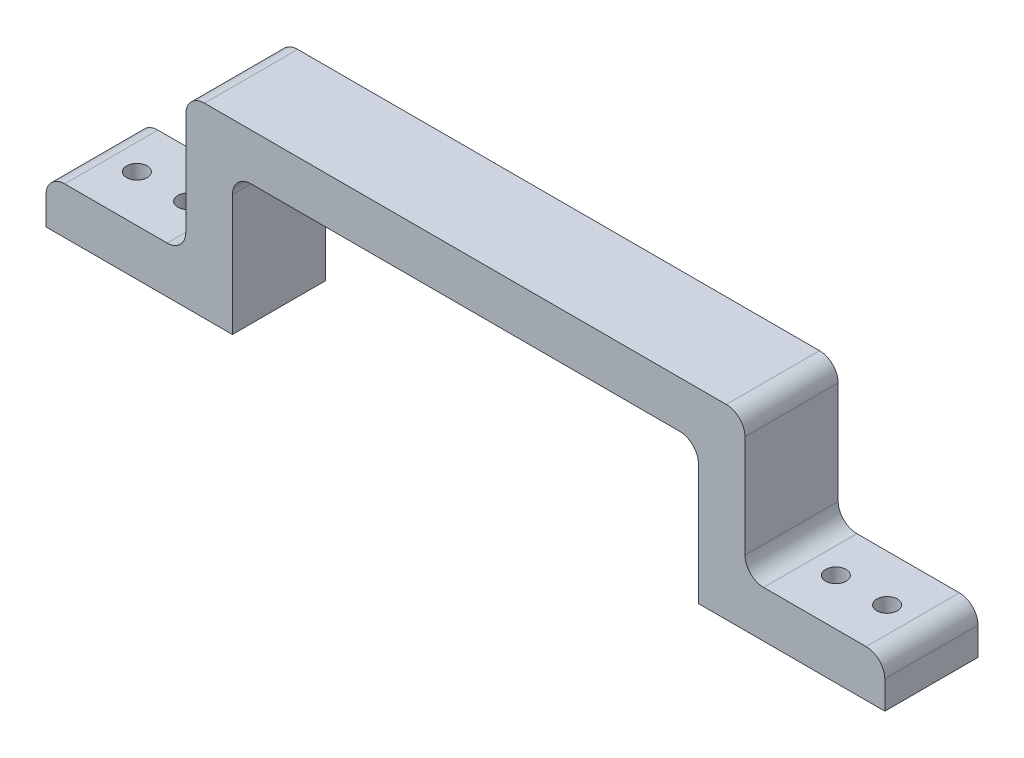
ISO-10303-21;
HEADER;
FILE_DESCRIPTION(('STEP AP214'),'2;1');
FILE_NAME('part.step','',(''),(''),'','','');
FILE_SCHEMA(('AUTOMOTIVE_DESIGN { 1 0 10303 214 1 1 1 1 }'));
ENDSEC;
DATA;
#1=APPLICATION_CONTEXT('core data for automotive mechanical design processes');
#2=APPLICATION_PROTOCOL_DEFINITION('international standard','automotive_design',2000,#1);
#3=PRODUCT_CONTEXT('',#1,'mechanical');
#4=PRODUCT('Part','Part','',(#3));
#5=PRODUCT_RELATED_PRODUCT_CATEGORY('part','',(#4));
#6=PRODUCT_DEFINITION_FORMATION('','',#4);
#7=PRODUCT_DEFINITION_CONTEXT('part definition',#1,'design');
#8=PRODUCT_DEFINITION('design','',#6,#7);
#9=PRODUCT_DEFINITION_SHAPE('','',#8);
#10=(LENGTH_UNIT() NAMED_UNIT(*) SI_UNIT(.MILLI.,.METRE.));
#11=(NAMED_UNIT(*) PLANE_ANGLE_UNIT() SI_UNIT($,.RADIAN.));
#12=(NAMED_UNIT(*) SI_UNIT($,.STERADIAN.) SOLID_ANGLE_UNIT());
#13=UNCERTAINTY_MEASURE_WITH_UNIT(LENGTH_MEASURE(1.E-05),#10,'distance_accuracy_value','');
#14=(GEOMETRIC_REPRESENTATION_CONTEXT(3) GLOBAL_UNCERTAINTY_ASSIGNED_CONTEXT((#13)) GLOBAL_UNIT_ASSIGNED_CONTEXT((#10,
#11,#12)) REPRESENTATION_CONTEXT('',''));
#15=CARTESIAN_POINT('',(0.,0.,0.));
#16=DIRECTION('',(0.,0.,1.));
#17=DIRECTION('',(1.,0.,0.));
#18=AXIS2_PLACEMENT_3D('',#15,#16,#17);
#19=CARTESIAN_POINT('',(50.,0.,20.));
#20=DIRECTION('',(0.,1.,0.));
#21=DIRECTION('',(0.,0.,1.));
#22=AXIS2_PLACEMENT_3D('',#19,#20,#21);
#23=PLANE('',#22);
#24=CARTESIAN_POINT('',(80.5,0.,10.));
#25=DIRECTION('',(0.,1.,0.));
#26=DIRECTION('',(0.,0.,1.));
#27=AXIS2_PLACEMENT_3D('',#24,#25,#26);
#28=CIRCLE('',#27,2.2);
#29=CARTESIAN_POINT('',(80.5,0.,12.2));
#30=VERTEX_POINT('',#29);
#31=EDGE_CURVE('E219',#30,#30,#28,.T.);
#32=ORIENTED_EDGE('',*,*,#31,.T.);
#33=EDGE_LOOP('',(#32));
#34=FACE_BOUND('',#33,.T.);
#35=CARTESIAN_POINT('',(69.5,0.,10.));
#36=DIRECTION('',(0.,1.,0.));
#37=DIRECTION('',(0.,0.,1.));
#38=AXIS2_PLACEMENT_3D('',#35,#36,#37);
#39=CIRCLE('',#38,2.2);
#40=CARTESIAN_POINT('',(69.5,0.,12.2));
#41=VERTEX_POINT('',#40);
#42=EDGE_CURVE('E347',#41,#41,#39,.T.);
#43=ORIENTED_EDGE('',*,*,#42,.T.);
#44=EDGE_LOOP('',(#43));
#45=FACE_BOUND('',#44,.T.);
#46=DIRECTION('',(1.,0.,0.));
#47=VECTOR('',#46,1.);
#48=CARTESIAN_POINT('',(50.,0.,0.));
#49=LINE('',#48,#47);
#50=CARTESIAN_POINT('',(50.,0.,0.));
#51=VERTEX_POINT('',#50);
#52=CARTESIAN_POINT('',(90.,0.,0.));
#53=VERTEX_POINT('',#52);
#54=EDGE_CURVE('E214',#51,#53,#49,.T.);
#55=ORIENTED_EDGE('',*,*,#54,.T.);
#56=DIRECTION('',(0.,0.,-1.));
#57=VECTOR('',#56,1.);
#58=CARTESIAN_POINT('',(90.,0.,20.));
#59=LINE('',#58,#57);
#60=CARTESIAN_POINT('',(90.,0.,20.));
#61=VERTEX_POINT('',#60);
#62=EDGE_CURVE('E11',#61,#53,#59,.T.);
#63=ORIENTED_EDGE('',*,*,#62,.F.);
#64=DIRECTION('',(1.,0.,0.));
#65=VECTOR('',#64,1.);
#66=CARTESIAN_POINT('',(50.,0.,20.));
#67=LINE('',#66,#65);
#68=CARTESIAN_POINT('',(50.,0.,20.));
#69=VERTEX_POINT('',#68);
#70=EDGE_CURVE('E273',#69,#61,#67,.T.);
#71=ORIENTED_EDGE('',*,*,#70,.F.);
#72=DIRECTION('',(0.,0.,-1.));
#73=VECTOR('',#72,1.);
#74=CARTESIAN_POINT('',(50.,0.,20.));
#75=LINE('',#74,#73);
#76=EDGE_CURVE('E210',#69,#51,#75,.T.);
#77=ORIENTED_EDGE('',*,*,#76,.T.);
#78=EDGE_LOOP('',(#55,#63,#71,#77));
#79=FACE_BOUND('',#78,.T.);
#80=ADVANCED_FACE('F39',(#34,#45,#79),#23,.F.);
#81=CARTESIAN_POINT('',(90.,5.99999999999997,20.));
#82=DIRECTION('',(-1.,0.,0.));
#83=DIRECTION('',(0.,0.,1.));
#84=AXIS2_PLACEMENT_3D('',#81,#82,#83);
#85=PLANE('',#84);
#86=DIRECTION('',(0.,1.,0.));
#87=VECTOR('',#86,1.);
#88=CARTESIAN_POINT('',(90.,5.99999999999997,0.));
#89=LINE('',#88,#87);
#90=CARTESIAN_POINT('',(90.,5.99999999999998,0.));
#91=VERTEX_POINT('',#90);
#92=EDGE_CURVE('E218',#53,#91,#89,.T.);
#93=ORIENTED_EDGE('',*,*,#92,.T.);
#94=DIRECTION('',(0.,0.,-1.));
#95=VECTOR('',#94,1.);
#96=CARTESIAN_POINT('',(90.,5.99999999999998,20.));
#97=LINE('',#96,#95);
#98=CARTESIAN_POINT('',(90.,5.99999999999998,20.));
#99=VERTEX_POINT('',#98);
#100=EDGE_CURVE('E49',#99,#91,#97,.T.);
#101=ORIENTED_EDGE('',*,*,#100,.F.);
#102=DIRECTION('',(0.,1.,0.));
#103=VECTOR('',#102,1.);
#104=CARTESIAN_POINT('',(90.,5.99999999999997,20.));
#105=LINE('',#104,#103);
#106=EDGE_CURVE('E137',#61,#99,#105,.T.);
#107=ORIENTED_EDGE('',*,*,#106,.F.);
#108=ORIENTED_EDGE('',*,*,#62,.T.);
#109=EDGE_LOOP('',(#93,#101,#107,#108));
#110=FACE_BOUND('',#109,.T.);
#111=ADVANCED_FACE('F439',(#110),#85,.F.);
#112=CARTESIAN_POINT('',(86.,6.,20.));
#113=DIRECTION('',(0.,0.,-1.));
#114=DIRECTION('',(-1.,0.,0.));
#115=AXIS2_PLACEMENT_3D('',#112,#113,#114);
#116=CYLINDRICAL_SURFACE('',#115,4.);
#117=CARTESIAN_POINT('',(86.,6.,0.));
#118=DIRECTION('',(0.,0.,1.));
#119=DIRECTION('',(-1.,0.,0.));
#120=AXIS2_PLACEMENT_3D('',#117,#118,#119);
#121=CIRCLE('',#120,4.);
#122=CARTESIAN_POINT('',(86.,10.,0.));
#123=VERTEX_POINT('',#122);
#124=EDGE_CURVE('E222',#91,#123,#121,.T.);
#125=ORIENTED_EDGE('',*,*,#124,.T.);
#126=DIRECTION('',(0.,0.,-1.));
#127=VECTOR('',#126,1.);
#128=CARTESIAN_POINT('',(86.,10.,20.));
#129=LINE('',#128,#127);
#130=CARTESIAN_POINT('',(86.,10.,20.));
#131=VERTEX_POINT('',#130);
#132=EDGE_CURVE('E332',#131,#123,#129,.T.);
#133=ORIENTED_EDGE('',*,*,#132,.F.);
#134=CARTESIAN_POINT('',(86.,6.,20.));
#135=DIRECTION('',(0.,0.,1.));
#136=DIRECTION('',(-1.,0.,0.));
#137=AXIS2_PLACEMENT_3D('',#134,#135,#136);
#138=CIRCLE('',#137,4.);
#139=EDGE_CURVE('E369',#99,#131,#138,.T.);
#140=ORIENTED_EDGE('',*,*,#139,.F.);
#141=ORIENTED_EDGE('',*,*,#100,.T.);
#142=EDGE_LOOP('',(#125,#133,#140,#141));
#143=FACE_BOUND('',#142,.T.);
#144=ADVANCED_FACE('F444',(#143),#116,.T.);
#145=CARTESIAN_POINT('',(64.,10.,20.));
#146=DIRECTION('',(0.,-1.,0.));
#147=DIRECTION('',(0.,0.,-1.));
#148=AXIS2_PLACEMENT_3D('',#145,#146,#147);
#149=PLANE('',#148);
#150=CARTESIAN_POINT('',(80.5,10.,10.));
#151=DIRECTION('',(0.,1.,0.));
#152=DIRECTION('',(0.,0.,-1.));
#153=AXIS2_PLACEMENT_3D('',#150,#151,#152);
#154=CIRCLE('',#153,2.2);
#155=CARTESIAN_POINT('',(80.5,10.,7.8));
#156=VERTEX_POINT('',#155);
#157=EDGE_CURVE('E349',#156,#156,#154,.T.);
#158=ORIENTED_EDGE('',*,*,#157,.F.);
#159=EDGE_LOOP('',(#158));
#160=FACE_BOUND('',#159,.T.);
#161=CARTESIAN_POINT('',(69.5,10.,10.));
#162=DIRECTION('',(0.,1.,0.));
#163=DIRECTION('',(0.,0.,1.));
#164=AXIS2_PLACEMENT_3D('',#161,#162,#163);
#165=CIRCLE('',#164,2.2);
#166=CARTESIAN_POINT('',(69.5,10.,12.2));
#167=VERTEX_POINT('',#166);
#168=EDGE_CURVE('E341',#167,#167,#165,.T.);
#169=ORIENTED_EDGE('',*,*,#168,.F.);
#170=EDGE_LOOP('',(#169));
#171=FACE_BOUND('',#170,.T.);
#172=DIRECTION('',(-1.,0.,0.));
#173=VECTOR('',#172,1.);
#174=CARTESIAN_POINT('',(64.,10.,0.));
#175=LINE('',#174,#173);
#176=CARTESIAN_POINT('',(64.,10.,0.));
#177=VERTEX_POINT('',#176);
#178=EDGE_CURVE('E225',#123,#177,#175,.T.);
#179=ORIENTED_EDGE('',*,*,#178,.T.);
#180=DIRECTION('',(0.,0.,-1.));
#181=VECTOR('',#180,1.);
#182=CARTESIAN_POINT('',(64.,10.,20.));
#183=LINE('',#182,#181);
#184=CARTESIAN_POINT('',(64.,10.,20.));
#185=VERTEX_POINT('',#184);
#186=EDGE_CURVE('E328',#185,#177,#183,.T.);
#187=ORIENTED_EDGE('',*,*,#186,.F.);
#188=DIRECTION('',(-1.,0.,0.));
#189=VECTOR('',#188,1.);
#190=CARTESIAN_POINT('',(64.,10.,20.));
#191=LINE('',#190,#189);
#192=EDGE_CURVE('E372',#131,#185,#191,.T.);
#193=ORIENTED_EDGE('',*,*,#192,.F.);
#194=ORIENTED_EDGE('',*,*,#132,.T.);
#195=EDGE_LOOP('',(#179,#187,#193,#194));
#196=FACE_BOUND('',#195,.T.);
#197=ADVANCED_FACE('F545',(#160,#171,#196),#149,.F.);
#198=CARTESIAN_POINT('',(64.,14.,20.));
#199=DIRECTION('',(0.,0.,-1.));
#200=DIRECTION('',(-1.,0.,0.));
#201=AXIS2_PLACEMENT_3D('',#198,#199,#200);
#202=CYLINDRICAL_SURFACE('',#201,4.);
#203=CARTESIAN_POINT('',(64.,14.,0.));
#204=DIRECTION('',(0.,0.,-1.));
#205=DIRECTION('',(1.,0.,0.));
#206=AXIS2_PLACEMENT_3D('',#203,#204,#205);
#207=CIRCLE('',#206,4.);
#208=CARTESIAN_POINT('',(60.,14.,0.));
#209=VERTEX_POINT('',#208);
#210=EDGE_CURVE('E228',#177,#209,#207,.T.);
#211=ORIENTED_EDGE('',*,*,#210,.T.);
#212=DIRECTION('',(0.,0.,-1.));
#213=VECTOR('',#212,1.);
#214=CARTESIAN_POINT('',(60.,14.,20.));
#215=LINE('',#214,#213);
#216=CARTESIAN_POINT('',(60.,14.,20.));
#217=VERTEX_POINT('',#216);
#218=EDGE_CURVE('E324',#217,#209,#215,.T.);
#219=ORIENTED_EDGE('',*,*,#218,.F.);
#220=CARTESIAN_POINT('',(64.,14.,20.));
#221=DIRECTION('',(0.,0.,-1.));
#222=DIRECTION('',(1.,0.,0.));
#223=AXIS2_PLACEMENT_3D('',#220,#221,#222);
#224=CIRCLE('',#223,4.);
#225=EDGE_CURVE('E375',#185,#217,#224,.T.);
#226=ORIENTED_EDGE('',*,*,#225,.F.);
#227=ORIENTED_EDGE('',*,*,#186,.T.);
#228=EDGE_LOOP('',(#211,#219,#226,#227));
#229=FACE_BOUND('',#228,.T.);
#230=ADVANCED_FACE('F541',(#229),#202,.F.);
#231=CARTESIAN_POINT('',(60.,36.,20.));
#232=DIRECTION('',(-1.,0.,0.));
#233=DIRECTION('',(0.,-1.,0.));
#234=AXIS2_PLACEMENT_3D('',#231,#232,#233);
#235=PLANE('',#234);
#236=DIRECTION('',(0.,1.,0.));
#237=VECTOR('',#236,1.);
#238=CARTESIAN_POINT('',(60.,36.,0.));
#239=LINE('',#238,#237);
#240=CARTESIAN_POINT('',(60.,36.,0.));
#241=VERTEX_POINT('',#240);
#242=EDGE_CURVE('E231',#209,#241,#239,.T.);
#243=ORIENTED_EDGE('',*,*,#242,.T.);
#244=DIRECTION('',(0.,0.,-1.));
#245=VECTOR('',#244,1.);
#246=CARTESIAN_POINT('',(60.,36.,20.));
#247=LINE('',#246,#245);
#248=CARTESIAN_POINT('',(60.,36.,20.));
#249=VERTEX_POINT('',#248);
#250=EDGE_CURVE('E320',#249,#241,#247,.T.);
#251=ORIENTED_EDGE('',*,*,#250,.F.);
#252=DIRECTION('',(0.,1.,0.));
#253=VECTOR('',#252,1.);
#254=CARTESIAN_POINT('',(60.,36.,20.));
#255=LINE('',#254,#253);
#256=EDGE_CURVE('E378',#217,#249,#255,.T.);
#257=ORIENTED_EDGE('',*,*,#256,.F.);
#258=ORIENTED_EDGE('',*,*,#218,.T.);
#259=EDGE_LOOP('',(#243,#251,#257,#258));
#260=FACE_BOUND('',#259,.T.);
#261=ADVANCED_FACE('F537',(#260),#235,.F.);
#262=CARTESIAN_POINT('',(56.,36.,20.));
#263=DIRECTION('',(0.,0.,-1.));
#264=DIRECTION('',(-1.,0.,0.));
#265=AXIS2_PLACEMENT_3D('',#262,#263,#264);
#266=CYLINDRICAL_SURFACE('',#265,4.);
#267=CARTESIAN_POINT('',(56.,36.,0.));
#268=DIRECTION('',(0.,0.,1.));
#269=DIRECTION('',(-1.,0.,0.));
#270=AXIS2_PLACEMENT_3D('',#267,#268,#269);
#271=CIRCLE('',#270,4.);
#272=CARTESIAN_POINT('',(56.,40.,0.));
#273=VERTEX_POINT('',#272);
#274=EDGE_CURVE('E234',#241,#273,#271,.T.);
#275=ORIENTED_EDGE('',*,*,#274,.T.);
#276=DIRECTION('',(0.,0.,-1.));
#277=VECTOR('',#276,1.);
#278=CARTESIAN_POINT('',(56.,40.,20.));
#279=LINE('',#278,#277);
#280=CARTESIAN_POINT('',(56.,40.,20.));
#281=VERTEX_POINT('',#280);
#282=EDGE_CURVE('E316',#281,#273,#279,.T.);
#283=ORIENTED_EDGE('',*,*,#282,.F.);
#284=CARTESIAN_POINT('',(56.,36.,20.));
#285=DIRECTION('',(0.,0.,1.));
#286=DIRECTION('',(-1.,0.,0.));
#287=AXIS2_PLACEMENT_3D('',#284,#285,#286);
#288=CIRCLE('',#287,4.);
#289=EDGE_CURVE('E381',#249,#281,#288,.T.);
#290=ORIENTED_EDGE('',*,*,#289,.F.);
#291=ORIENTED_EDGE('',*,*,#250,.T.);
#292=EDGE_LOOP('',(#275,#283,#290,#291));
#293=FACE_BOUND('',#292,.T.);
#294=ADVANCED_FACE('F533',(#293),#266,.T.);
#295=CARTESIAN_POINT('',(-56.,40.,20.));
#296=DIRECTION('',(0.,-1.,0.));
#297=DIRECTION('',(0.,0.,-1.));
#298=AXIS2_PLACEMENT_3D('',#295,#296,#297);
#299=PLANE('',#298);
#300=DIRECTION('',(-1.,0.,0.));
#301=VECTOR('',#300,1.);
#302=CARTESIAN_POINT('',(-56.,40.,0.));
#303=LINE('',#302,#301);
#304=CARTESIAN_POINT('',(-56.,40.,0.));
#305=VERTEX_POINT('',#304);
#306=EDGE_CURVE('E237',#273,#305,#303,.T.);
#307=ORIENTED_EDGE('',*,*,#306,.T.);
#308=DIRECTION('',(0.,0.,-1.));
#309=VECTOR('',#308,1.);
#310=CARTESIAN_POINT('',(-56.,40.,20.));
#311=LINE('',#310,#309);
#312=CARTESIAN_POINT('',(-56.,40.,20.));
#313=VERTEX_POINT('',#312);
#314=EDGE_CURVE('E312',#313,#305,#311,.T.);
#315=ORIENTED_EDGE('',*,*,#314,.F.);
#316=DIRECTION('',(-1.,0.,0.));
#317=VECTOR('',#316,1.);
#318=CARTESIAN_POINT('',(-56.,40.,20.));
#319=LINE('',#318,#317);
#320=EDGE_CURVE('E384',#281,#313,#319,.T.);
#321=ORIENTED_EDGE('',*,*,#320,.F.);
#322=ORIENTED_EDGE('',*,*,#282,.T.);
#323=EDGE_LOOP('',(#307,#315,#321,#322));
#324=FACE_BOUND('',#323,.T.);
#325=ADVANCED_FACE('F529',(#324),#299,.F.);
#326=CARTESIAN_POINT('',(-56.,36.,20.));
#327=DIRECTION('',(0.,0.,-1.));
#328=DIRECTION('',(-1.,0.,0.));
#329=AXIS2_PLACEMENT_3D('',#326,#327,#328);
#330=CYLINDRICAL_SURFACE('',#329,4.);
#331=CARTESIAN_POINT('',(-56.,36.,0.));
#332=DIRECTION('',(0.,0.,1.));
#333=DIRECTION('',(1.,0.,0.));
#334=AXIS2_PLACEMENT_3D('',#331,#332,#333);
#335=CIRCLE('',#334,4.);
#336=CARTESIAN_POINT('',(-60.,36.,0.));
#337=VERTEX_POINT('',#336);
#338=EDGE_CURVE('E240',#305,#337,#335,.T.);
#339=ORIENTED_EDGE('',*,*,#338,.T.);
#340=DIRECTION('',(0.,0.,-1.));
#341=VECTOR('',#340,1.);
#342=CARTESIAN_POINT('',(-60.,36.,20.));
#343=LINE('',#342,#341);
#344=CARTESIAN_POINT('',(-60.,36.,20.));
#345=VERTEX_POINT('',#344);
#346=EDGE_CURVE('E308',#345,#337,#343,.T.);
#347=ORIENTED_EDGE('',*,*,#346,.F.);
#348=CARTESIAN_POINT('',(-56.,36.,20.));
#349=DIRECTION('',(0.,0.,1.));
#350=DIRECTION('',(1.,0.,0.));
#351=AXIS2_PLACEMENT_3D('',#348,#349,#350);
#352=CIRCLE('',#351,4.);
#353=EDGE_CURVE('E387',#313,#345,#352,.T.);
#354=ORIENTED_EDGE('',*,*,#353,.F.);
#355=ORIENTED_EDGE('',*,*,#314,.T.);
#356=EDGE_LOOP('',(#339,#347,#354,#355));
#357=FACE_BOUND('',#356,.T.);
#358=ADVANCED_FACE('F525',(#357),#330,.T.);
#359=CARTESIAN_POINT('',(-60.,36.,20.));
#360=DIRECTION('',(1.,0.,0.));
#361=DIRECTION('',(0.,1.,0.));
#362=AXIS2_PLACEMENT_3D('',#359,#360,#361);
#363=PLANE('',#362);
#364=DIRECTION('',(0.,-1.,0.));
#365=VECTOR('',#364,1.);
#366=CARTESIAN_POINT('',(-60.,36.,0.));
#367=LINE('',#366,#365);
#368=CARTESIAN_POINT('',(-60.,14.,0.));
#369=VERTEX_POINT('',#368);
#370=EDGE_CURVE('E243',#337,#369,#367,.T.);
#371=ORIENTED_EDGE('',*,*,#370,.T.);
#372=DIRECTION('',(0.,0.,-1.));
#373=VECTOR('',#372,1.);
#374=CARTESIAN_POINT('',(-60.,14.,20.));
#375=LINE('',#374,#373);
#376=CARTESIAN_POINT('',(-60.,14.,20.));
#377=VERTEX_POINT('',#376);
#378=EDGE_CURVE('E304',#377,#369,#375,.T.);
#379=ORIENTED_EDGE('',*,*,#378,.F.);
#380=DIRECTION('',(0.,-1.,0.));
#381=VECTOR('',#380,1.);
#382=CARTESIAN_POINT('',(-60.,36.,20.));
#383=LINE('',#382,#381);
#384=EDGE_CURVE('E390',#345,#377,#383,.T.);
#385=ORIENTED_EDGE('',*,*,#384,.F.);
#386=ORIENTED_EDGE('',*,*,#346,.T.);
#387=EDGE_LOOP('',(#371,#379,#385,#386));
#388=FACE_BOUND('',#387,.T.);
#389=ADVANCED_FACE('F521',(#388),#363,.F.);
#390=CARTESIAN_POINT('',(-64.,14.,20.));
#391=DIRECTION('',(0.,0.,-1.));
#392=DIRECTION('',(-1.,0.,0.));
#393=AXIS2_PLACEMENT_3D('',#390,#391,#392);
#394=CYLINDRICAL_SURFACE('',#393,4.);
#395=CARTESIAN_POINT('',(-64.,14.,0.));
#396=DIRECTION('',(0.,0.,-1.));
#397=DIRECTION('',(-1.,0.,0.));
#398=AXIS2_PLACEMENT_3D('',#395,#396,#397);
#399=CIRCLE('',#398,4.);
#400=CARTESIAN_POINT('',(-64.,10.,0.));
#401=VERTEX_POINT('',#400);
#402=EDGE_CURVE('E246',#369,#401,#399,.T.);
#403=ORIENTED_EDGE('',*,*,#402,.T.);
#404=DIRECTION('',(0.,0.,-1.));
#405=VECTOR('',#404,1.);
#406=CARTESIAN_POINT('',(-64.,10.,20.));
#407=LINE('',#406,#405);
#408=CARTESIAN_POINT('',(-64.,10.,20.));
#409=VERTEX_POINT('',#408);
#410=EDGE_CURVE('E300',#409,#401,#407,.T.);
#411=ORIENTED_EDGE('',*,*,#410,.F.);
#412=CARTESIAN_POINT('',(-64.,14.,20.));
#413=DIRECTION('',(0.,0.,-1.));
#414=DIRECTION('',(-1.,0.,0.));
#415=AXIS2_PLACEMENT_3D('',#412,#413,#414);
#416=CIRCLE('',#415,4.);
#417=EDGE_CURVE('E393',#377,#409,#416,.T.);
#418=ORIENTED_EDGE('',*,*,#417,.F.);
#419=ORIENTED_EDGE('',*,*,#378,.T.);
#420=EDGE_LOOP('',(#403,#411,#418,#419));
#421=FACE_BOUND('',#420,.T.);
#422=ADVANCED_FACE('F486',(#421),#394,.F.);
#423=CARTESIAN_POINT('',(-64.,10.,20.));
#424=DIRECTION('',(0.,-1.,0.));
#425=DIRECTION('',(0.,0.,-1.));
#426=AXIS2_PLACEMENT_3D('',#423,#424,#425);
#427=PLANE('',#426);
#428=CARTESIAN_POINT('',(-80.5,10.,10.));
#429=DIRECTION('',(0.,1.,0.));
#430=DIRECTION('',(0.,0.,1.));
#431=AXIS2_PLACEMENT_3D('',#428,#429,#430);
#432=CIRCLE('',#431,2.2);
#433=CARTESIAN_POINT('',(-80.5,10.,12.2));
#434=VERTEX_POINT('',#433);
#435=EDGE_CURVE('E355',#434,#434,#432,.T.);
#436=ORIENTED_EDGE('',*,*,#435,.F.);
#437=EDGE_LOOP('',(#436));
#438=FACE_BOUND('',#437,.T.);
#439=CARTESIAN_POINT('',(-69.5,10.,10.));
#440=DIRECTION('',(0.,1.,0.));
#441=DIRECTION('',(0.,0.,-1.));
#442=AXIS2_PLACEMENT_3D('',#439,#440,#441);
#443=CIRCLE('',#442,2.2);
#444=CARTESIAN_POINT('',(-69.5,10.,7.8));
#445=VERTEX_POINT('',#444);
#446=EDGE_CURVE('E474',#445,#445,#443,.T.);
#447=ORIENTED_EDGE('',*,*,#446,.F.);
#448=EDGE_LOOP('',(#447));
#449=FACE_BOUND('',#448,.T.);
#450=DIRECTION('',(-1.,0.,0.));
#451=VECTOR('',#450,1.);
#452=CARTESIAN_POINT('',(-64.,10.,0.));
#453=LINE('',#452,#451);
#454=CARTESIAN_POINT('',(-86.,10.,0.));
#455=VERTEX_POINT('',#454);
#456=EDGE_CURVE('E249',#401,#455,#453,.T.);
#457=ORIENTED_EDGE('',*,*,#456,.T.);
#458=DIRECTION('',(0.,0.,-1.));
#459=VECTOR('',#458,1.);
#460=CARTESIAN_POINT('',(-86.,10.,20.));
#461=LINE('',#460,#459);
#462=CARTESIAN_POINT('',(-86.,10.,20.));
#463=VERTEX_POINT('',#462);
#464=EDGE_CURVE('E296',#463,#455,#461,.T.);
#465=ORIENTED_EDGE('',*,*,#464,.F.);
#466=DIRECTION('',(-1.,0.,0.));
#467=VECTOR('',#466,1.);
#468=CARTESIAN_POINT('',(-64.,10.,20.));
#469=LINE('',#468,#467);
#470=EDGE_CURVE('E396',#409,#463,#469,.T.);
#471=ORIENTED_EDGE('',*,*,#470,.F.);
#472=ORIENTED_EDGE('',*,*,#410,.T.);
#473=EDGE_LOOP('',(#457,#465,#471,#472));
#474=FACE_BOUND('',#473,.T.);
#475=ADVANCED_FACE('F483',(#438,#449,#474),#427,.F.);
#476=CARTESIAN_POINT('',(-86.,6.,20.));
#477=DIRECTION('',(0.,0.,-1.));
#478=DIRECTION('',(-1.,0.,0.));
#479=AXIS2_PLACEMENT_3D('',#476,#477,#478);
#480=CYLINDRICAL_SURFACE('',#479,4.);
#481=CARTESIAN_POINT('',(-86.,6.,0.));
#482=DIRECTION('',(0.,0.,1.));
#483=DIRECTION('',(1.,0.,0.));
#484=AXIS2_PLACEMENT_3D('',#481,#482,#483);
#485=CIRCLE('',#484,4.);
#486=CARTESIAN_POINT('',(-90.,5.99999999999997,0.));
#487=VERTEX_POINT('',#486);
#488=EDGE_CURVE('E252',#455,#487,#485,.T.);
#489=ORIENTED_EDGE('',*,*,#488,.T.);
#490=DIRECTION('',(0.,0.,-1.));
#491=VECTOR('',#490,1.);
#492=CARTESIAN_POINT('',(-90.,5.99999999999997,20.));
#493=LINE('',#492,#491);
#494=CARTESIAN_POINT('',(-90.,5.99999999999997,20.));
#495=VERTEX_POINT('',#494);
#496=EDGE_CURVE('E292',#495,#487,#493,.T.);
#497=ORIENTED_EDGE('',*,*,#496,.F.);
#498=CARTESIAN_POINT('',(-86.,6.,20.));
#499=DIRECTION('',(0.,0.,1.));
#500=DIRECTION('',(1.,0.,0.));
#501=AXIS2_PLACEMENT_3D('',#498,#499,#500);
#502=CIRCLE('',#501,4.);
#503=EDGE_CURVE('E399',#463,#495,#502,.T.);
#504=ORIENTED_EDGE('',*,*,#503,.F.);
#505=ORIENTED_EDGE('',*,*,#464,.T.);
#506=EDGE_LOOP('',(#489,#497,#504,#505));
#507=FACE_BOUND('',#506,.T.);
#508=ADVANCED_FACE('F485',(#507),#480,.T.);
#509=CARTESIAN_POINT('',(-90.,5.99999999999997,20.));
#510=DIRECTION('',(1.,0.,0.));
#511=DIRECTION('',(0.,0.,-1.));
#512=AXIS2_PLACEMENT_3D('',#509,#510,#511);
#513=PLANE('',#512);
#514=DIRECTION('',(0.,-1.,0.));
#515=VECTOR('',#514,1.);
#516=CARTESIAN_POINT('',(-90.,5.99999999999997,0.));
#517=LINE('',#516,#515);
#518=CARTESIAN_POINT('',(-90.,0.,0.));
#519=VERTEX_POINT('',#518);
#520=EDGE_CURVE('E255',#487,#519,#517,.T.);
#521=ORIENTED_EDGE('',*,*,#520,.T.);
#522=DIRECTION('',(0.,0.,-1.));
#523=VECTOR('',#522,1.);
#524=CARTESIAN_POINT('',(-90.,0.,20.));
#525=LINE('',#524,#523);
#526=CARTESIAN_POINT('',(-90.,0.,20.));
#527=VERTEX_POINT('',#526);
#528=EDGE_CURVE('E288',#527,#519,#525,.T.);
#529=ORIENTED_EDGE('',*,*,#528,.F.);
#530=DIRECTION('',(0.,-1.,0.));
#531=VECTOR('',#530,1.);
#532=CARTESIAN_POINT('',(-90.,5.99999999999997,20.));
#533=LINE('',#532,#531);
#534=EDGE_CURVE('E402',#495,#527,#533,.T.);
#535=ORIENTED_EDGE('',*,*,#534,.F.);
#536=ORIENTED_EDGE('',*,*,#496,.T.);
#537=EDGE_LOOP('',(#521,#529,#535,#536));
#538=FACE_BOUND('',#537,.T.);
#539=ADVANCED_FACE('F502',(#538),#513,.F.);
#540=CARTESIAN_POINT('',(-50.,0.,20.));
#541=DIRECTION('',(0.,1.,0.));
#542=DIRECTION('',(0.,0.,1.));
#543=AXIS2_PLACEMENT_3D('',#540,#541,#542);
#544=PLANE('',#543);
#545=CARTESIAN_POINT('',(-80.5,0.,10.));
#546=DIRECTION('',(0.,1.,0.));
#547=DIRECTION('',(0.,0.,1.));
#548=AXIS2_PLACEMENT_3D('',#545,#546,#547);
#549=CIRCLE('',#548,2.2);
#550=CARTESIAN_POINT('',(-80.5,0.,12.2));
#551=VERTEX_POINT('',#550);
#552=EDGE_CURVE('E42',#551,#551,#549,.T.);
#553=ORIENTED_EDGE('',*,*,#552,.T.);
#554=EDGE_LOOP('',(#553));
#555=FACE_BOUND('',#554,.T.);
#556=CARTESIAN_POINT('',(-69.5,0.,10.));
#557=DIRECTION('',(0.,1.,0.));
#558=DIRECTION('',(0.,0.,1.));
#559=AXIS2_PLACEMENT_3D('',#556,#557,#558);
#560=CIRCLE('',#559,2.2);
#561=CARTESIAN_POINT('',(-69.5,0.,12.2));
#562=VERTEX_POINT('',#561);
#563=EDGE_CURVE('E338',#562,#562,#560,.T.);
#564=ORIENTED_EDGE('',*,*,#563,.T.);
#565=EDGE_LOOP('',(#564));
#566=FACE_BOUND('',#565,.T.);
#567=DIRECTION('',(1.,0.,0.));
#568=VECTOR('',#567,1.);
#569=CARTESIAN_POINT('',(-50.,0.,0.));
#570=LINE('',#569,#568);
#571=CARTESIAN_POINT('',(-50.,0.,0.));
#572=VERTEX_POINT('',#571);
#573=EDGE_CURVE('E258',#519,#572,#570,.T.);
#574=ORIENTED_EDGE('',*,*,#573,.T.);
#575=DIRECTION('',(0.,0.,-1.));
#576=VECTOR('',#575,1.);
#577=CARTESIAN_POINT('',(-50.,0.,20.));
#578=LINE('',#577,#576);
#579=CARTESIAN_POINT('',(-50.,0.,20.));
#580=VERTEX_POINT('',#579);
#581=EDGE_CURVE('E284',#580,#572,#578,.T.);
#582=ORIENTED_EDGE('',*,*,#581,.F.);
#583=DIRECTION('',(1.,0.,0.));
#584=VECTOR('',#583,1.);
#585=CARTESIAN_POINT('',(-50.,0.,20.));
#586=LINE('',#585,#584);
#587=EDGE_CURVE('E405',#527,#580,#586,.T.);
#588=ORIENTED_EDGE('',*,*,#587,.F.);
#589=ORIENTED_EDGE('',*,*,#528,.T.);
#590=EDGE_LOOP('',(#574,#582,#588,#589));
#591=FACE_BOUND('',#590,.T.);
#592=ADVANCED_FACE('F505',(#555,#566,#591),#544,.F.);
#593=CARTESIAN_POINT('',(-50.,26.,20.));
#594=DIRECTION('',(-1.,0.,0.));
#595=DIRECTION('',(0.,0.,1.));
#596=AXIS2_PLACEMENT_3D('',#593,#594,#595);
#597=PLANE('',#596);
#598=DIRECTION('',(0.,1.,0.));
#599=VECTOR('',#598,1.);
#600=CARTESIAN_POINT('',(-50.,26.,0.));
#601=LINE('',#600,#599);
#602=CARTESIAN_POINT('',(-50.,26.,0.));
#603=VERTEX_POINT('',#602);
#604=EDGE_CURVE('E261',#572,#603,#601,.T.);
#605=ORIENTED_EDGE('',*,*,#604,.T.);
#606=DIRECTION('',(0.,0.,-1.));
#607=VECTOR('',#606,1.);
#608=CARTESIAN_POINT('',(-50.,26.,20.));
#609=LINE('',#608,#607);
#610=CARTESIAN_POINT('',(-50.,26.,20.));
#611=VERTEX_POINT('',#610);
#612=EDGE_CURVE('E280',#611,#603,#609,.T.);
#613=ORIENTED_EDGE('',*,*,#612,.F.);
#614=DIRECTION('',(0.,1.,0.));
#615=VECTOR('',#614,1.);
#616=CARTESIAN_POINT('',(-50.,26.,20.));
#617=LINE('',#616,#615);
#618=EDGE_CURVE('E408',#580,#611,#617,.T.);
#619=ORIENTED_EDGE('',*,*,#618,.F.);
#620=ORIENTED_EDGE('',*,*,#581,.T.);
#621=EDGE_LOOP('',(#605,#613,#619,#620));
#622=FACE_BOUND('',#621,.T.);
#623=ADVANCED_FACE('F416',(#622),#597,.F.);
#624=CARTESIAN_POINT('',(-46.,26.,20.));
#625=DIRECTION('',(0.,0.,-1.));
#626=DIRECTION('',(-1.,0.,0.));
#627=AXIS2_PLACEMENT_3D('',#624,#625,#626);
#628=CYLINDRICAL_SURFACE('',#627,4.);
#629=CARTESIAN_POINT('',(-46.,26.,0.));
#630=DIRECTION('',(0.,0.,-1.));
#631=DIRECTION('',(-1.,0.,0.));
#632=AXIS2_PLACEMENT_3D('',#629,#630,#631);
#633=CIRCLE('',#632,4.);
#634=CARTESIAN_POINT('',(-46.,30.,0.));
#635=VERTEX_POINT('',#634);
#636=EDGE_CURVE('E264',#603,#635,#633,.T.);
#637=ORIENTED_EDGE('',*,*,#636,.T.);
#638=DIRECTION('',(0.,0.,-1.));
#639=VECTOR('',#638,1.);
#640=CARTESIAN_POINT('',(-46.,30.,20.));
#641=LINE('',#640,#639);
#642=CARTESIAN_POINT('',(-46.,30.,20.));
#643=VERTEX_POINT('',#642);
#644=EDGE_CURVE('E203',#643,#635,#641,.T.);
#645=ORIENTED_EDGE('',*,*,#644,.F.);
#646=CARTESIAN_POINT('',(-46.,26.,20.));
#647=DIRECTION('',(0.,0.,-1.));
#648=DIRECTION('',(-1.,0.,0.));
#649=AXIS2_PLACEMENT_3D('',#646,#647,#648);
#650=CIRCLE('',#649,4.);
#651=EDGE_CURVE('E192',#611,#643,#650,.T.);
#652=ORIENTED_EDGE('',*,*,#651,.F.);
#653=ORIENTED_EDGE('',*,*,#612,.T.);
#654=EDGE_LOOP('',(#637,#645,#652,#653));
#655=FACE_BOUND('',#654,.T.);
#656=ADVANCED_FACE('F420',(#655),#628,.F.);
#657=CARTESIAN_POINT('',(-46.,30.,20.));
#658=DIRECTION('',(0.,1.,0.));
#659=DIRECTION('',(0.,0.,1.));
#660=AXIS2_PLACEMENT_3D('',#657,#658,#659);
#661=PLANE('',#660);
#662=DIRECTION('',(1.,0.,0.));
#663=VECTOR('',#662,1.);
#664=CARTESIAN_POINT('',(-46.,30.,0.));
#665=LINE('',#664,#663);
#666=CARTESIAN_POINT('',(46.,30.,0.));
#667=VERTEX_POINT('',#666);
#668=EDGE_CURVE('E201',#635,#667,#665,.T.);
#669=ORIENTED_EDGE('',*,*,#668,.T.);
#670=DIRECTION('',(0.,0.,-1.));
#671=VECTOR('',#670,1.);
#672=CARTESIAN_POINT('',(46.,30.,20.));
#673=LINE('',#672,#671);
#674=CARTESIAN_POINT('',(46.,30.,20.));
#675=VERTEX_POINT('',#674);
#676=EDGE_CURVE('E198',#675,#667,#673,.T.);
#677=ORIENTED_EDGE('',*,*,#676,.F.);
#678=DIRECTION('',(1.,0.,0.));
#679=VECTOR('',#678,1.);
#680=CARTESIAN_POINT('',(-46.,30.,20.));
#681=LINE('',#680,#679);
#682=EDGE_CURVE('E186',#643,#675,#681,.T.);
#683=ORIENTED_EDGE('',*,*,#682,.F.);
#684=ORIENTED_EDGE('',*,*,#644,.T.);
#685=EDGE_LOOP('',(#669,#677,#683,#684));
#686=FACE_BOUND('',#685,.T.);
#687=ADVANCED_FACE('F199',(#686),#661,.F.);
#688=CARTESIAN_POINT('',(46.,26.,20.));
#689=DIRECTION('',(0.,0.,-1.));
#690=DIRECTION('',(-1.,0.,0.));
#691=AXIS2_PLACEMENT_3D('',#688,#689,#690);
#692=CYLINDRICAL_SURFACE('',#691,4.);
#693=CARTESIAN_POINT('',(46.,26.,0.));
#694=DIRECTION('',(0.,0.,-1.));
#695=DIRECTION('',(1.,0.,0.));
#696=AXIS2_PLACEMENT_3D('',#693,#694,#695);
#697=CIRCLE('',#696,4.);
#698=CARTESIAN_POINT('',(50.,26.,0.));
#699=VERTEX_POINT('',#698);
#700=EDGE_CURVE('E123',#667,#699,#697,.T.);
#701=ORIENTED_EDGE('',*,*,#700,.T.);
#702=DIRECTION('',(0.,0.,-1.));
#703=VECTOR('',#702,1.);
#704=CARTESIAN_POINT('',(50.,26.,20.));
#705=LINE('',#704,#703);
#706=CARTESIAN_POINT('',(50.,26.,20.));
#707=VERTEX_POINT('',#706);
#708=EDGE_CURVE('E204',#707,#699,#705,.T.);
#709=ORIENTED_EDGE('',*,*,#708,.F.);
#710=CARTESIAN_POINT('',(46.,26.,20.));
#711=DIRECTION('',(0.,0.,-1.));
#712=DIRECTION('',(1.,0.,0.));
#713=AXIS2_PLACEMENT_3D('',#710,#711,#712);
#714=CIRCLE('',#713,4.);
#715=EDGE_CURVE('E190',#675,#707,#714,.T.);
#716=ORIENTED_EDGE('',*,*,#715,.F.);
#717=ORIENTED_EDGE('',*,*,#676,.T.);
#718=EDGE_LOOP('',(#701,#709,#716,#717));
#719=FACE_BOUND('',#718,.T.);
#720=ADVANCED_FACE('F206',(#719),#692,.F.);
#721=CARTESIAN_POINT('',(50.,26.,20.));
#722=DIRECTION('',(1.,0.,0.));
#723=DIRECTION('',(0.,0.,-1.));
#724=AXIS2_PLACEMENT_3D('',#721,#722,#723);
#725=PLANE('',#724);
#726=DIRECTION('',(0.,-1.,0.));
#727=VECTOR('',#726,1.);
#728=CARTESIAN_POINT('',(50.,26.,0.));
#729=LINE('',#728,#727);
#730=EDGE_CURVE('E129',#699,#51,#729,.T.);
#731=ORIENTED_EDGE('',*,*,#730,.T.);
#732=ORIENTED_EDGE('',*,*,#76,.F.);
#733=DIRECTION('',(0.,-1.,0.));
#734=VECTOR('',#733,1.);
#735=CARTESIAN_POINT('',(50.,26.,20.));
#736=LINE('',#735,#734);
#737=EDGE_CURVE('E58',#707,#69,#736,.T.);
#738=ORIENTED_EDGE('',*,*,#737,.F.);
#739=ORIENTED_EDGE('',*,*,#708,.T.);
#740=EDGE_LOOP('',(#731,#732,#738,#739));
#741=FACE_BOUND('',#740,.T.);
#742=ADVANCED_FACE('F428',(#741),#725,.F.);
#743=CARTESIAN_POINT('',(86.,6.,20.));
#744=DIRECTION('',(0.,0.,-1.));
#745=DIRECTION('',(-1.,0.,0.));
#746=AXIS2_PLACEMENT_3D('',#743,#744,#745);
#747=PLANE('',#746);
#748=ORIENTED_EDGE('',*,*,#70,.T.);
#749=ORIENTED_EDGE('',*,*,#106,.T.);
#750=ORIENTED_EDGE('',*,*,#139,.T.);
#751=ORIENTED_EDGE('',*,*,#192,.T.);
#752=ORIENTED_EDGE('',*,*,#225,.T.);
#753=ORIENTED_EDGE('',*,*,#256,.T.);
#754=ORIENTED_EDGE('',*,*,#289,.T.);
#755=ORIENTED_EDGE('',*,*,#320,.T.);
#756=ORIENTED_EDGE('',*,*,#353,.T.);
#757=ORIENTED_EDGE('',*,*,#384,.T.);
#758=ORIENTED_EDGE('',*,*,#417,.T.);
#759=ORIENTED_EDGE('',*,*,#470,.T.);
#760=ORIENTED_EDGE('',*,*,#503,.T.);
#761=ORIENTED_EDGE('',*,*,#534,.T.);
#762=ORIENTED_EDGE('',*,*,#587,.T.);
#763=ORIENTED_EDGE('',*,*,#618,.T.);
#764=ORIENTED_EDGE('',*,*,#651,.T.);
#765=ORIENTED_EDGE('',*,*,#682,.T.);
#766=ORIENTED_EDGE('',*,*,#715,.T.);
#767=ORIENTED_EDGE('',*,*,#737,.T.);
#768=EDGE_LOOP('',(#748,#749,#750,#751,#752,#753,#754,#755,#756,#757,#758,#759,#760,#761,#762,
#763,#764,#765,#766,#767));
#769=FACE_BOUND('',#768,.T.);
#770=ADVANCED_FACE('F188',(#769),#747,.F.);
#771=CARTESIAN_POINT('',(86.,6.,0.));
#772=DIRECTION('',(0.,0.,-1.));
#773=DIRECTION('',(-1.,0.,0.));
#774=AXIS2_PLACEMENT_3D('',#771,#772,#773);
#775=PLANE('',#774);
#776=ORIENTED_EDGE('',*,*,#54,.F.);
#777=ORIENTED_EDGE('',*,*,#730,.F.);
#778=ORIENTED_EDGE('',*,*,#700,.F.);
#779=ORIENTED_EDGE('',*,*,#668,.F.);
#780=ORIENTED_EDGE('',*,*,#636,.F.);
#781=ORIENTED_EDGE('',*,*,#604,.F.);
#782=ORIENTED_EDGE('',*,*,#573,.F.);
#783=ORIENTED_EDGE('',*,*,#520,.F.);
#784=ORIENTED_EDGE('',*,*,#488,.F.);
#785=ORIENTED_EDGE('',*,*,#456,.F.);
#786=ORIENTED_EDGE('',*,*,#402,.F.);
#787=ORIENTED_EDGE('',*,*,#370,.F.);
#788=ORIENTED_EDGE('',*,*,#338,.F.);
#789=ORIENTED_EDGE('',*,*,#306,.F.);
#790=ORIENTED_EDGE('',*,*,#274,.F.);
#791=ORIENTED_EDGE('',*,*,#242,.F.);
#792=ORIENTED_EDGE('',*,*,#210,.F.);
#793=ORIENTED_EDGE('',*,*,#178,.F.);
#794=ORIENTED_EDGE('',*,*,#124,.F.);
#795=ORIENTED_EDGE('',*,*,#92,.F.);
#796=EDGE_LOOP('',(#776,#777,#778,#779,#780,#781,#782,#783,#784,#785,#786,#787,#788,#789,#790,
#791,#792,#793,#794,#795));
#797=FACE_BOUND('',#796,.T.);
#798=ADVANCED_FACE('F423',(#797),#775,.T.);
#799=CARTESIAN_POINT('',(-69.5,-10.,10.));
#800=DIRECTION('',(0.,1.,0.));
#801=DIRECTION('',(0.,0.,1.));
#802=AXIS2_PLACEMENT_3D('',#799,#800,#801);
#803=CYLINDRICAL_SURFACE('',#802,2.2);
#804=ORIENTED_EDGE('',*,*,#446,.T.);
#805=EDGE_LOOP('',(#804));
#806=FACE_BOUND('',#805,.T.);
#807=ORIENTED_EDGE('',*,*,#563,.F.);
#808=EDGE_LOOP('',(#807));
#809=FACE_BOUND('',#808,.T.);
#810=ADVANCED_FACE('F460',(#806,#809),#803,.F.);
#811=CARTESIAN_POINT('',(-80.5,-10.,10.));
#812=DIRECTION('',(0.,1.,0.));
#813=DIRECTION('',(0.,0.,1.));
#814=AXIS2_PLACEMENT_3D('',#811,#812,#813);
#815=CYLINDRICAL_SURFACE('',#814,2.2);
#816=ORIENTED_EDGE('',*,*,#435,.T.);
#817=EDGE_LOOP('',(#816));
#818=FACE_BOUND('',#817,.T.);
#819=ORIENTED_EDGE('',*,*,#552,.F.);
#820=EDGE_LOOP('',(#819));
#821=FACE_BOUND('',#820,.T.);
#822=ADVANCED_FACE('F452',(#818,#821),#815,.F.);
#823=CARTESIAN_POINT('',(69.5,-10.,10.));
#824=DIRECTION('',(0.,1.,0.));
#825=DIRECTION('',(0.,0.,1.));
#826=AXIS2_PLACEMENT_3D('',#823,#824,#825);
#827=CYLINDRICAL_SURFACE('',#826,2.2);
#828=ORIENTED_EDGE('',*,*,#168,.T.);
#829=EDGE_LOOP('',(#828));
#830=FACE_BOUND('',#829,.T.);
#831=ORIENTED_EDGE('',*,*,#42,.F.);
#832=EDGE_LOOP('',(#831));
#833=FACE_BOUND('',#832,.T.);
#834=ADVANCED_FACE('F449',(#830,#833),#827,.F.);
#835=CARTESIAN_POINT('',(80.5,-10.,10.));
#836=DIRECTION('',(0.,1.,0.));
#837=DIRECTION('',(0.,0.,1.));
#838=AXIS2_PLACEMENT_3D('',#835,#836,#837);
#839=CYLINDRICAL_SURFACE('',#838,2.2);
#840=ORIENTED_EDGE('',*,*,#157,.T.);
#841=EDGE_LOOP('',(#840));
#842=FACE_BOUND('',#841,.T.);
#843=ORIENTED_EDGE('',*,*,#31,.F.);
#844=EDGE_LOOP('',(#843));
#845=FACE_BOUND('',#844,.T.);
#846=ADVANCED_FACE('F451',(#842,#845),#839,.F.);
#847=CLOSED_SHELL('',(#80,#111,#144,#197,#230,#261,#294,#325,#358,#389,#422,#475,#508,#539,#592,
#623,#656,#687,#720,#742,#770,#798,#810,#822,#834,#846));
#848=MANIFOLD_SOLID_BREP('B2',#847);
#849=ADVANCED_BREP_SHAPE_REPRESENTATION('',(#18,#848),#14);
#850=SHAPE_DEFINITION_REPRESENTATION(#9,#849);
ENDSEC;
END-ISO-10303-21;
